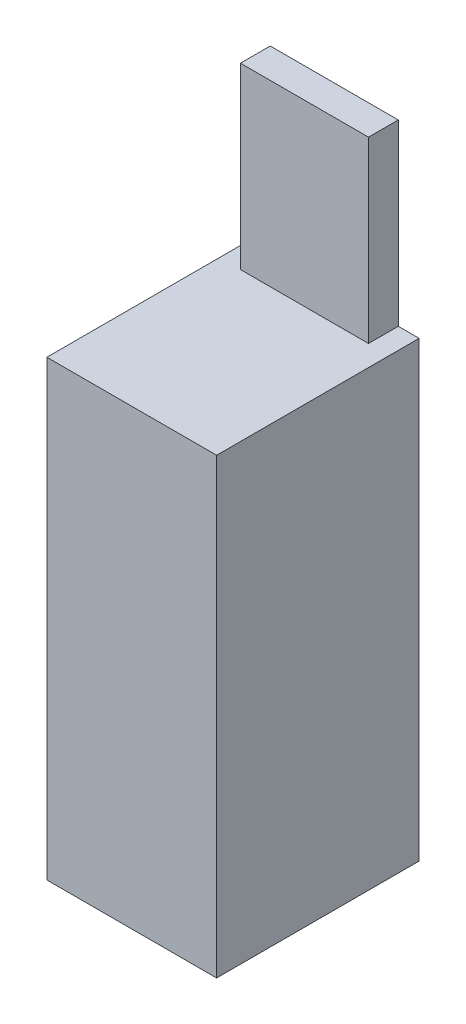
ISO-10303-21;
HEADER;
FILE_DESCRIPTION(('STEP AP214'),'2;1');
FILE_NAME('part.step','',(''),(''),'','','');
FILE_SCHEMA(('AUTOMOTIVE_DESIGN { 1 0 10303 214 1 1 1 1 }'));
ENDSEC;
DATA;
#1=APPLICATION_CONTEXT('core data for automotive mechanical design processes');
#2=APPLICATION_PROTOCOL_DEFINITION('international standard','automotive_design',2000,#1);
#3=PRODUCT_CONTEXT('',#1,'mechanical');
#4=PRODUCT('Part','Part','',(#3));
#5=PRODUCT_RELATED_PRODUCT_CATEGORY('part','',(#4));
#6=PRODUCT_DEFINITION_FORMATION('','',#4);
#7=PRODUCT_DEFINITION_CONTEXT('part definition',#1,'design');
#8=PRODUCT_DEFINITION('design','',#6,#7);
#9=PRODUCT_DEFINITION_SHAPE('','',#8);
#10=(LENGTH_UNIT() NAMED_UNIT(*) SI_UNIT(.MILLI.,.METRE.));
#11=(NAMED_UNIT(*) PLANE_ANGLE_UNIT() SI_UNIT($,.RADIAN.));
#12=(NAMED_UNIT(*) SI_UNIT($,.STERADIAN.) SOLID_ANGLE_UNIT());
#13=UNCERTAINTY_MEASURE_WITH_UNIT(LENGTH_MEASURE(1.E-05),#10,'distance_accuracy_value','');
#14=(GEOMETRIC_REPRESENTATION_CONTEXT(3) GLOBAL_UNCERTAINTY_ASSIGNED_CONTEXT((#13)) GLOBAL_UNIT_ASSIGNED_CONTEXT((#10,
#11,#12)) REPRESENTATION_CONTEXT('',''));
#15=CARTESIAN_POINT('',(0.,0.,0.));
#16=DIRECTION('',(0.,0.,1.));
#17=DIRECTION('',(1.,0.,0.));
#18=AXIS2_PLACEMENT_3D('',#15,#16,#17);
#19=CARTESIAN_POINT('',(0.,76.,0.));
#20=DIRECTION('',(0.,-1.,0.));
#21=DIRECTION('',(0.,0.,-1.));
#22=AXIS2_PLACEMENT_3D('',#19,#20,#21);
#23=PLANE('',#22);
#24=DIRECTION('',(0.,0.,-1.));
#25=VECTOR('',#24,1.);
#26=CARTESIAN_POINT('',(25.,76.,-29.));
#27=LINE('',#26,#25);
#28=CARTESIAN_POINT('',(25.,76.,-29.));
#29=VERTEX_POINT('',#28);
#30=CARTESIAN_POINT('',(25.,76.,-34.));
#31=VERTEX_POINT('',#30);
#32=EDGE_CURVE('E48',#29,#31,#27,.T.);
#33=ORIENTED_EDGE('',*,*,#32,.F.);
#34=DIRECTION('',(1.,0.,0.));
#35=VECTOR('',#34,1.);
#36=CARTESIAN_POINT('',(3.49999999999999,76.,-29.));
#37=LINE('',#36,#35);
#38=CARTESIAN_POINT('',(3.49999999999999,76.,-29.));
#39=VERTEX_POINT('',#38);
#40=EDGE_CURVE('E117',#39,#29,#37,.T.);
#41=ORIENTED_EDGE('',*,*,#40,.F.);
#42=DIRECTION('',(0.,0.,1.));
#43=VECTOR('',#42,1.);
#44=CARTESIAN_POINT('',(3.49999999999999,76.,-29.));
#45=LINE('',#44,#43);
#46=CARTESIAN_POINT('',(3.49999999999999,76.,-34.));
#47=VERTEX_POINT('',#46);
#48=EDGE_CURVE('E54',#47,#39,#45,.T.);
#49=ORIENTED_EDGE('',*,*,#48,.F.);
#50=DIRECTION('',(-1.,0.,0.));
#51=VECTOR('',#50,1.);
#52=CARTESIAN_POINT('',(0.,76.,-34.));
#53=LINE('',#52,#51);
#54=CARTESIAN_POINT('',(0.,76.,-34.));
#55=VERTEX_POINT('',#54);
#56=EDGE_CURVE('E137',#47,#55,#53,.T.);
#57=ORIENTED_EDGE('',*,*,#56,.T.);
#58=DIRECTION('',(0.,0.,1.));
#59=VECTOR('',#58,1.);
#60=CARTESIAN_POINT('',(0.,76.,0.));
#61=LINE('',#60,#59);
#62=CARTESIAN_POINT('',(0.,76.,0.));
#63=VERTEX_POINT('',#62);
#64=EDGE_CURVE('E129',#55,#63,#61,.T.);
#65=ORIENTED_EDGE('',*,*,#64,.T.);
#66=DIRECTION('',(1.,0.,0.));
#67=VECTOR('',#66,1.);
#68=CARTESIAN_POINT('',(0.,76.,0.));
#69=LINE('',#68,#67);
#70=CARTESIAN_POINT('',(28.5,76.,0.));
#71=VERTEX_POINT('',#70);
#72=EDGE_CURVE('E132',#63,#71,#69,.T.);
#73=ORIENTED_EDGE('',*,*,#72,.T.);
#74=DIRECTION('',(0.,0.,-1.));
#75=VECTOR('',#74,1.);
#76=CARTESIAN_POINT('',(28.5,76.,0.));
#77=LINE('',#76,#75);
#78=CARTESIAN_POINT('',(28.5,76.,-34.));
#79=VERTEX_POINT('',#78);
#80=EDGE_CURVE('E135',#71,#79,#77,.T.);
#81=ORIENTED_EDGE('',*,*,#80,.T.);
#82=EDGE_CURVE('E138',#79,#31,#53,.T.);
#83=ORIENTED_EDGE('',*,*,#82,.T.);
#84=EDGE_LOOP('',(#33,#41,#49,#57,#65,#73,#81,#83));
#85=FACE_BOUND('',#84,.T.);
#86=ADVANCED_FACE('F33',(#85),#23,.F.);
#87=CARTESIAN_POINT('',(0.,76.,0.));
#88=DIRECTION('',(1.,0.,0.));
#89=DIRECTION('',(0.,0.,-1.));
#90=AXIS2_PLACEMENT_3D('',#87,#88,#89);
#91=PLANE('',#90);
#92=DIRECTION('',(0.,0.,1.));
#93=VECTOR('',#92,1.);
#94=CARTESIAN_POINT('',(0.,0.,0.));
#95=LINE('',#94,#93);
#96=CARTESIAN_POINT('',(0.,0.,-34.));
#97=VERTEX_POINT('',#96);
#98=CARTESIAN_POINT('',(0.,0.,0.));
#99=VERTEX_POINT('',#98);
#100=EDGE_CURVE('E120',#97,#99,#95,.T.);
#101=ORIENTED_EDGE('',*,*,#100,.T.);
#102=DIRECTION('',(0.,-1.,0.));
#103=VECTOR('',#102,1.);
#104=CARTESIAN_POINT('',(0.,76.,0.));
#105=LINE('',#104,#103);
#106=EDGE_CURVE('E11',#63,#99,#105,.T.);
#107=ORIENTED_EDGE('',*,*,#106,.F.);
#108=ORIENTED_EDGE('',*,*,#64,.F.);
#109=DIRECTION('',(0.,-1.,0.));
#110=VECTOR('',#109,1.);
#111=CARTESIAN_POINT('',(0.,76.,-34.));
#112=LINE('',#111,#110);
#113=EDGE_CURVE('E139',#55,#97,#112,.T.);
#114=ORIENTED_EDGE('',*,*,#113,.T.);
#115=EDGE_LOOP('',(#101,#107,#108,#114));
#116=FACE_BOUND('',#115,.T.);
#117=ADVANCED_FACE('F35',(#116),#91,.F.);
#118=CARTESIAN_POINT('',(0.,76.,0.));
#119=DIRECTION('',(0.,0.,-1.));
#120=DIRECTION('',(-1.,0.,0.));
#121=AXIS2_PLACEMENT_3D('',#118,#119,#120);
#122=PLANE('',#121);
#123=DIRECTION('',(1.,0.,0.));
#124=VECTOR('',#123,1.);
#125=CARTESIAN_POINT('',(0.,0.,0.));
#126=LINE('',#125,#124);
#127=CARTESIAN_POINT('',(28.5,0.,0.));
#128=VERTEX_POINT('',#127);
#129=EDGE_CURVE('E123',#99,#128,#126,.T.);
#130=ORIENTED_EDGE('',*,*,#129,.T.);
#131=DIRECTION('',(0.,-1.,0.));
#132=VECTOR('',#131,1.);
#133=CARTESIAN_POINT('',(28.5,76.,0.));
#134=LINE('',#133,#132);
#135=EDGE_CURVE('E41',#71,#128,#134,.T.);
#136=ORIENTED_EDGE('',*,*,#135,.F.);
#137=ORIENTED_EDGE('',*,*,#72,.F.);
#138=ORIENTED_EDGE('',*,*,#106,.T.);
#139=EDGE_LOOP('',(#130,#136,#137,#138));
#140=FACE_BOUND('',#139,.T.);
#141=ADVANCED_FACE('F191',(#140),#122,.F.);
#142=CARTESIAN_POINT('',(28.5,76.,0.));
#143=DIRECTION('',(-1.,0.,0.));
#144=DIRECTION('',(0.,0.,1.));
#145=AXIS2_PLACEMENT_3D('',#142,#143,#144);
#146=PLANE('',#145);
#147=DIRECTION('',(0.,0.,-1.));
#148=VECTOR('',#147,1.);
#149=CARTESIAN_POINT('',(28.5,0.,0.));
#150=LINE('',#149,#148);
#151=CARTESIAN_POINT('',(28.5,0.,-34.));
#152=VERTEX_POINT('',#151);
#153=EDGE_CURVE('E142',#128,#152,#150,.T.);
#154=ORIENTED_EDGE('',*,*,#153,.T.);
#155=DIRECTION('',(0.,-1.,0.));
#156=VECTOR('',#155,1.);
#157=CARTESIAN_POINT('',(28.5,76.,-34.));
#158=LINE('',#157,#156);
#159=EDGE_CURVE('E147',#79,#152,#158,.T.);
#160=ORIENTED_EDGE('',*,*,#159,.F.);
#161=ORIENTED_EDGE('',*,*,#80,.F.);
#162=ORIENTED_EDGE('',*,*,#135,.T.);
#163=EDGE_LOOP('',(#154,#160,#161,#162));
#164=FACE_BOUND('',#163,.T.);
#165=ADVANCED_FACE('F154',(#164),#146,.F.);
#166=CARTESIAN_POINT('',(0.,76.,-34.));
#167=DIRECTION('',(0.,0.,1.));
#168=DIRECTION('',(1.,0.,0.));
#169=AXIS2_PLACEMENT_3D('',#166,#167,#168);
#170=PLANE('',#169);
#171=DIRECTION('',(-1.,0.,0.));
#172=VECTOR('',#171,1.);
#173=CARTESIAN_POINT('',(0.,0.,-34.));
#174=LINE('',#173,#172);
#175=EDGE_CURVE('E133',#152,#97,#174,.T.);
#176=ORIENTED_EDGE('',*,*,#175,.T.);
#177=ORIENTED_EDGE('',*,*,#113,.F.);
#178=ORIENTED_EDGE('',*,*,#56,.F.);
#179=DIRECTION('',(0.,-1.,0.));
#180=VECTOR('',#179,1.);
#181=CARTESIAN_POINT('',(3.49999999999999,106.,-34.));
#182=LINE('',#181,#180);
#183=CARTESIAN_POINT('',(3.49999999999999,106.,-34.));
#184=VERTEX_POINT('',#183);
#185=EDGE_CURVE('E104',#184,#47,#182,.T.);
#186=ORIENTED_EDGE('',*,*,#185,.F.);
#187=DIRECTION('',(-1.,0.,0.));
#188=VECTOR('',#187,1.);
#189=CARTESIAN_POINT('',(3.49999999999999,106.,-34.));
#190=LINE('',#189,#188);
#191=CARTESIAN_POINT('',(25.,106.,-34.));
#192=VERTEX_POINT('',#191);
#193=EDGE_CURVE('E97',#192,#184,#190,.T.);
#194=ORIENTED_EDGE('',*,*,#193,.F.);
#195=DIRECTION('',(0.,-1.,0.));
#196=VECTOR('',#195,1.);
#197=CARTESIAN_POINT('',(25.,106.,-34.));
#198=LINE('',#197,#196);
#199=EDGE_CURVE('E102',#192,#31,#198,.T.);
#200=ORIENTED_EDGE('',*,*,#199,.T.);
#201=ORIENTED_EDGE('',*,*,#82,.F.);
#202=ORIENTED_EDGE('',*,*,#159,.T.);
#203=EDGE_LOOP('',(#176,#177,#178,#186,#194,#200,#201,#202));
#204=FACE_BOUND('',#203,.T.);
#205=ADVANCED_FACE('F99',(#204),#170,.F.);
#206=CARTESIAN_POINT('',(0.,0.,0.));
#207=DIRECTION('',(0.,-1.,0.));
#208=DIRECTION('',(0.,0.,-1.));
#209=AXIS2_PLACEMENT_3D('',#206,#207,#208);
#210=PLANE('',#209);
#211=ORIENTED_EDGE('',*,*,#100,.F.);
#212=ORIENTED_EDGE('',*,*,#175,.F.);
#213=ORIENTED_EDGE('',*,*,#153,.F.);
#214=ORIENTED_EDGE('',*,*,#129,.F.);
#215=EDGE_LOOP('',(#211,#212,#213,#214));
#216=FACE_BOUND('',#215,.T.);
#217=ADVANCED_FACE('F160',(#216),#210,.T.);
#218=CARTESIAN_POINT('',(25.,106.,-29.));
#219=DIRECTION('',(-1.,0.,0.));
#220=DIRECTION('',(0.,0.,1.));
#221=AXIS2_PLACEMENT_3D('',#218,#219,#220);
#222=PLANE('',#221);
#223=ORIENTED_EDGE('',*,*,#32,.T.);
#224=ORIENTED_EDGE('',*,*,#199,.F.);
#225=DIRECTION('',(0.,0.,-1.));
#226=VECTOR('',#225,1.);
#227=CARTESIAN_POINT('',(25.,106.,-29.));
#228=LINE('',#227,#226);
#229=CARTESIAN_POINT('',(25.,106.,-29.));
#230=VERTEX_POINT('',#229);
#231=EDGE_CURVE('E108',#230,#192,#228,.T.);
#232=ORIENTED_EDGE('',*,*,#231,.F.);
#233=DIRECTION('',(0.,-1.,0.));
#234=VECTOR('',#233,1.);
#235=CARTESIAN_POINT('',(25.,106.,-29.));
#236=LINE('',#235,#234);
#237=EDGE_CURVE('E170',#230,#29,#236,.T.);
#238=ORIENTED_EDGE('',*,*,#237,.T.);
#239=EDGE_LOOP('',(#223,#224,#232,#238));
#240=FACE_BOUND('',#239,.T.);
#241=ADVANCED_FACE('F119',(#240),#222,.F.);
#242=CARTESIAN_POINT('',(3.49999999999999,106.,-29.));
#243=DIRECTION('',(1.,0.,0.));
#244=DIRECTION('',(0.,0.,-1.));
#245=AXIS2_PLACEMENT_3D('',#242,#243,#244);
#246=PLANE('',#245);
#247=ORIENTED_EDGE('',*,*,#48,.T.);
#248=DIRECTION('',(0.,-1.,0.));
#249=VECTOR('',#248,1.);
#250=CARTESIAN_POINT('',(3.49999999999999,106.,-29.));
#251=LINE('',#250,#249);
#252=CARTESIAN_POINT('',(3.49999999999999,106.,-29.));
#253=VERTEX_POINT('',#252);
#254=EDGE_CURVE('E125',#253,#39,#251,.T.);
#255=ORIENTED_EDGE('',*,*,#254,.F.);
#256=DIRECTION('',(0.,0.,1.));
#257=VECTOR('',#256,1.);
#258=CARTESIAN_POINT('',(3.49999999999999,106.,-29.));
#259=LINE('',#258,#257);
#260=EDGE_CURVE('E107',#184,#253,#259,.T.);
#261=ORIENTED_EDGE('',*,*,#260,.F.);
#262=ORIENTED_EDGE('',*,*,#185,.T.);
#263=EDGE_LOOP('',(#247,#255,#261,#262));
#264=FACE_BOUND('',#263,.T.);
#265=ADVANCED_FACE('F166',(#264),#246,.F.);
#266=CARTESIAN_POINT('',(3.49999999999999,106.,-29.));
#267=DIRECTION('',(0.,0.,-1.));
#268=DIRECTION('',(-1.,0.,0.));
#269=AXIS2_PLACEMENT_3D('',#266,#267,#268);
#270=PLANE('',#269);
#271=ORIENTED_EDGE('',*,*,#40,.T.);
#272=ORIENTED_EDGE('',*,*,#237,.F.);
#273=DIRECTION('',(1.,0.,0.));
#274=VECTOR('',#273,1.);
#275=CARTESIAN_POINT('',(3.49999999999999,106.,-29.));
#276=LINE('',#275,#274);
#277=EDGE_CURVE('E113',#253,#230,#276,.T.);
#278=ORIENTED_EDGE('',*,*,#277,.F.);
#279=ORIENTED_EDGE('',*,*,#254,.T.);
#280=EDGE_LOOP('',(#271,#272,#278,#279));
#281=FACE_BOUND('',#280,.T.);
#282=ADVANCED_FACE('F177',(#281),#270,.F.);
#283=CARTESIAN_POINT('',(0.,106.,0.));
#284=DIRECTION('',(0.,-1.,0.));
#285=DIRECTION('',(0.,0.,-1.));
#286=AXIS2_PLACEMENT_3D('',#283,#284,#285);
#287=PLANE('',#286);
#288=ORIENTED_EDGE('',*,*,#231,.T.);
#289=ORIENTED_EDGE('',*,*,#193,.T.);
#290=ORIENTED_EDGE('',*,*,#260,.T.);
#291=ORIENTED_EDGE('',*,*,#277,.T.);
#292=EDGE_LOOP('',(#288,#289,#290,#291));
#293=FACE_BOUND('',#292,.T.);
#294=ADVANCED_FACE('F111',(#293),#287,.F.);
#295=CLOSED_SHELL('',(#86,#117,#141,#165,#205,#217,#241,#265,#282,#294));
#296=MANIFOLD_SOLID_BREP('B2',#295);
#297=ADVANCED_BREP_SHAPE_REPRESENTATION('',(#18,#296),#14);
#298=SHAPE_DEFINITION_REPRESENTATION(#9,#297);
ENDSEC;
END-ISO-10303-21;
